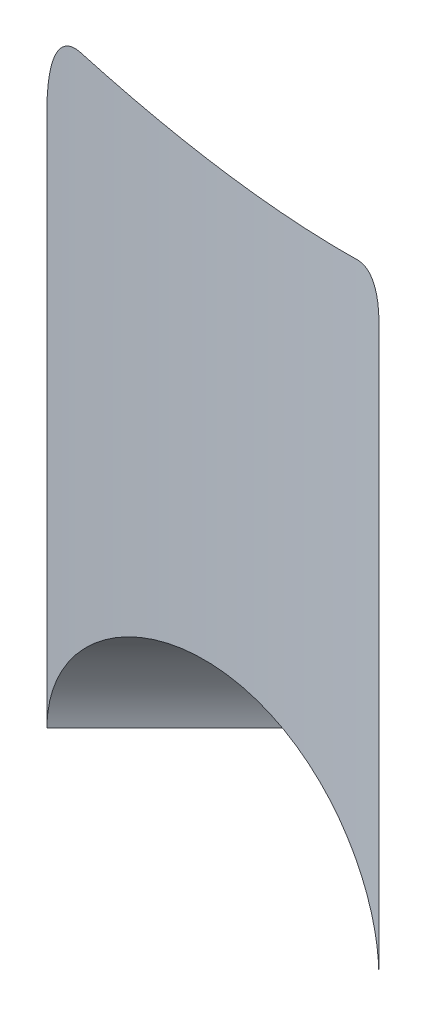
ISO-10303-21;
HEADER;
FILE_DESCRIPTION(('STEP AP214'),'2;1');
FILE_NAME('part.step','',(''),(''),'','','');
FILE_SCHEMA(('AUTOMOTIVE_DESIGN { 1 0 10303 214 1 1 1 1 }'));
ENDSEC;
DATA;
#1=APPLICATION_CONTEXT('core data for automotive mechanical design processes');
#2=APPLICATION_PROTOCOL_DEFINITION('international standard','automotive_design',2000,#1);
#3=PRODUCT_CONTEXT('',#1,'mechanical');
#4=PRODUCT('Part','Part','',(#3));
#5=PRODUCT_RELATED_PRODUCT_CATEGORY('part','',(#4));
#6=PRODUCT_DEFINITION_FORMATION('','',#4);
#7=PRODUCT_DEFINITION_CONTEXT('part definition',#1,'design');
#8=PRODUCT_DEFINITION('design','',#6,#7);
#9=PRODUCT_DEFINITION_SHAPE('','',#8);
#10=(LENGTH_UNIT() NAMED_UNIT(*) SI_UNIT(.MILLI.,.METRE.));
#11=(NAMED_UNIT(*) PLANE_ANGLE_UNIT() SI_UNIT($,.RADIAN.));
#12=(NAMED_UNIT(*) SI_UNIT($,.STERADIAN.) SOLID_ANGLE_UNIT());
#13=UNCERTAINTY_MEASURE_WITH_UNIT(LENGTH_MEASURE(1.E-05),#10,'distance_accuracy_value','');
#14=(GEOMETRIC_REPRESENTATION_CONTEXT(3) GLOBAL_UNCERTAINTY_ASSIGNED_CONTEXT((#13)) GLOBAL_UNIT_ASSIGNED_CONTEXT((#10,
#11,#12)) REPRESENTATION_CONTEXT('',''));
#15=CARTESIAN_POINT('',(0.,0.,0.));
#16=DIRECTION('',(0.,0.,1.));
#17=DIRECTION('',(1.,0.,0.));
#18=AXIS2_PLACEMENT_3D('',#15,#16,#17);
#19=CARTESIAN_POINT('',(8.98025612106916,25.4,8.98025612106915));
#20=DIRECTION('',(-0.707106781186547,0.,0.707106781186548));
#21=DIRECTION('',(0.707106781186548,0.,0.707106781186547));
#22=AXIS2_PLACEMENT_3D('',#19,#20,#21);
#23=PLANE('',#22);
#24=DIRECTION('',(0.,-1.,0.));
#25=VECTOR('',#24,1.);
#26=CARTESIAN_POINT('',(0.,25.4,0.));
#27=LINE('',#26,#25);
#28=CARTESIAN_POINT('',(0.,1.06417616721805,0.));
#29=VERTEX_POINT('',#28);
#30=CARTESIAN_POINT('',(0.,0.,0.));
#31=VERTEX_POINT('',#30);
#32=EDGE_CURVE('E86',#29,#31,#27,.T.);
#33=ORIENTED_EDGE('',*,*,#32,.F.);
#34=CARTESIAN_POINT('',(1.79605122421383,1.06417616721805,1.79605122421383));
#35=DIRECTION('',(-0.707106781186547,0.,0.707106781186548));
#36=DIRECTION('',(0.,1.,0.));
#37=AXIS2_PLACEMENT_3D('',#34,#35,#36);
#38=ELLIPSE('',#37,6.07254102360089,2.54);
#39=CARTESIAN_POINT('',(0.0480911682092522,2.46000430830473,0.0480911682092539));
#40=VERTEX_POINT('',#39);
#41=EDGE_CURVE('E11',#29,#40,#38,.F.);
#42=ORIENTED_EDGE('',*,*,#41,.T.);
#43=DIRECTION('',(-0.3638034375545,-0.857492925712545,-0.363803437554499));
#44=VECTOR('',#43,1.);
#45=CARTESIAN_POINT('',(9.56882300013742,24.9005844423548,9.56882300013741));
#46=LINE('',#45,#44);
#47=CARTESIAN_POINT('',(8.98025612106916,23.5133190044516,8.98025612106915));
#48=VERTEX_POINT('',#47);
#49=EDGE_CURVE('E43',#40,#48,#46,.F.);
#50=ORIENTED_EDGE('',*,*,#49,.T.);
#51=DIRECTION('',(0.,-1.,0.));
#52=VECTOR('',#51,1.);
#53=CARTESIAN_POINT('',(8.98025612106916,25.4,8.98025612106915));
#54=LINE('',#53,#52);
#55=CARTESIAN_POINT('',(8.98025612106918,0.,8.98025612106913));
#56=VERTEX_POINT('',#55);
#57=EDGE_CURVE('E80',#48,#56,#54,.T.);
#58=ORIENTED_EDGE('',*,*,#57,.T.);
#59=CARTESIAN_POINT('',(4.49012806053458,0.,4.49012806053458));
#60=DIRECTION('',(0.707106781186547,0.,-0.707106781186548));
#61=DIRECTION('',(-0.707106781186548,0.,-0.707106781186547));
#62=AXIS2_PLACEMENT_3D('',#59,#60,#61);
#63=CIRCLE('',#62,6.35);
#64=EDGE_CURVE('E83',#31,#56,#63,.T.);
#65=ORIENTED_EDGE('',*,*,#64,.F.);
#66=EDGE_LOOP('',(#33,#42,#50,#58,#65));
#67=FACE_BOUND('',#66,.T.);
#68=ADVANCED_FACE('F33',(#67),#23,.F.);
#69=CARTESIAN_POINT('',(0.,25.4,0.));
#70=DIRECTION('',(0.707106781186548,0.,0.707106781186547));
#71=DIRECTION('',(0.707106781186547,0.,-0.707106781186548));
#72=AXIS2_PLACEMENT_3D('',#69,#70,#71);
#73=PLANE('',#72);
#74=DIRECTION('',(0.,1.,0.));
#75=VECTOR('',#74,1.);
#76=CARTESIAN_POINT('',(-6.8922644178178,0.,6.89226441781783));
#77=LINE('',#76,#75);
#78=CARTESIAN_POINT('',(-6.89226441781783,0.,6.89226441781783));
#79=VERTEX_POINT('',#78);
#80=CARTESIAN_POINT('',(-6.8922644178178,22.2308428338847,6.89226441781783));
#81=VERTEX_POINT('',#80);
#82=EDGE_CURVE('E93',#79,#81,#77,.T.);
#83=ORIENTED_EDGE('',*,*,#82,.T.);
#84=DIRECTION('',(-0.295766009193431,0.908319842132485,0.295766009193431));
#85=VECTOR('',#84,1.);
#86=CARTESIAN_POINT('',(-6.53782235262836,21.1423243743904,6.53782235262836));
#87=LINE('',#86,#85);
#88=EDGE_CURVE('E56',#81,#29,#87,.F.);
#89=ORIENTED_EDGE('',*,*,#88,.T.);
#90=ORIENTED_EDGE('',*,*,#32,.T.);
#91=DIRECTION('',(-0.707106781186547,0.,0.707106781186548));
#92=VECTOR('',#91,1.);
#93=CARTESIAN_POINT('',(0.,0.,0.));
#94=LINE('',#93,#92);
#95=EDGE_CURVE('E87',#31,#79,#94,.T.);
#96=ORIENTED_EDGE('',*,*,#95,.T.);
#97=EDGE_LOOP('',(#83,#89,#90,#96));
#98=FACE_BOUND('',#97,.T.);
#99=ADVANCED_FACE('F140',(#98),#73,.F.);
#100=CARTESIAN_POINT('',(-4.49112806053456,0.,13.4713841816037));
#101=DIRECTION('',(0.707106781186547,0.,-0.707106781186548));
#102=DIRECTION('',(-0.707106781186548,0.,-0.707106781186547));
#103=AXIS2_PLACEMENT_3D('',#100,#101,#102);
#104=CYLINDRICAL_SURFACE('',#103,6.35);
#105=ORIENTED_EDGE('',*,*,#64,.T.);
#106=CARTESIAN_POINT('',(8.98025612106918,0.,8.98025612106913));
#107=CARTESIAN_POINT('',(8.98028727916899,0.158357361612671,8.98026703404575));
#108=CARTESIAN_POINT('',(8.97344885303893,0.316703547991888,8.97868788621782));
#109=CARTESIAN_POINT('',(8.94626316417468,0.632120023921862,8.97242969485254));
#110=CARTESIAN_POINT('',(8.92592031799142,0.789190713622889,8.96775166478971));
#111=CARTESIAN_POINT('',(8.87207146439379,1.10023989040585,8.95540235355817));
#112=CARTESIAN_POINT('',(8.83862223513458,1.25422874362985,8.94774398447619));
#113=CARTESIAN_POINT('',(8.75898183101324,1.55870422554307,8.92958157323562));
#114=CARTESIAN_POINT('',(8.71279013319498,1.70919071021873,8.91907741428495));
#115=CARTESIAN_POINT('',(8.60827087490437,2.00547837122198,8.89542745209661));
#116=CARTESIAN_POINT('',(8.54995676664387,2.15128453597488,8.88228457758399));
#117=CARTESIAN_POINT('',(8.42179571849198,2.43754587588542,8.85357256706417));
#118=CARTESIAN_POINT('',(8.3519444226039,2.57799900519756,8.83800251477358));
#119=CARTESIAN_POINT('',(8.20143908175379,2.85277046314988,8.80468860836407));
#120=CARTESIAN_POINT('',(8.12078169764317,2.98708687823385,8.78694408246445));
#121=CARTESIAN_POINT('',(7.9494438853484,3.24894658891941,8.74954892860098));
#122=CARTESIAN_POINT('',(7.8587596094564,3.37648725641468,8.72989756926768));
#123=CARTESIAN_POINT('',(7.66343482997481,3.63043560850455,8.68794536099224));
#124=CARTESIAN_POINT('',(7.55832299261667,3.7564671292079,8.66556113335063));
#125=CARTESIAN_POINT('',(7.33892041120087,4.00000790528168,8.61931767417679));
#126=CARTESIAN_POINT('',(7.22462640112382,4.11751409973217,8.59545791851298));
#127=CARTESIAN_POINT('',(6.86941460791614,4.45667316020166,8.52213913900117));
#128=CARTESIAN_POINT('',(6.61605894740883,4.6651052953412,8.47091714711418));
#129=CARTESIAN_POINT('',(6.04590232373012,5.07189214406527,8.35869242579117));
#130=CARTESIAN_POINT('',(5.72519880037003,5.26462935043573,8.29733255154434));
#131=CARTESIAN_POINT('',(5.0595157430664,5.6019940496537,8.17432400818323));
#132=CARTESIAN_POINT('',(4.71452278011242,5.74659467191534,8.11267519718465));
#133=CARTESIAN_POINT('',(3.94669164800132,6.00982071646219,7.98069778263842));
#134=CARTESIAN_POINT('',(3.52074873579007,6.11955699768101,7.91072395658688));
#135=CARTESIAN_POINT('',(2.65682435432407,6.27684363167682,7.77586773949873));
#136=CARTESIAN_POINT('',(2.21883656487727,6.32436067561438,7.71098809306805));
#137=CARTESIAN_POINT('',(1.26569672374652,6.36277423726781,7.57760085290529));
#138=CARTESIAN_POINT('',(0.749931810231433,6.34282883649299,7.51031206179378));
#139=CARTESIAN_POINT('',(-0.274613403661845,6.22456939109219,7.38625198507984));
#140=CARTESIAN_POINT('',(-0.78338374074013,6.12615339126273,7.32949450092641));
#141=CARTESIAN_POINT('',(-1.55500021020534,5.91422275931301,7.25030495161505));
#142=CARTESIAN_POINT('',(-1.82509108260923,5.82762450377184,7.22395113302292));
#143=CARTESIAN_POINT('',(-2.35714278570393,5.63114788578902,7.17456676234475));
#144=CARTESIAN_POINT('',(-2.61910176620909,5.52126426927965,7.15153696225926));
#145=CARTESIAN_POINT('',(-3.13186338808041,5.27817730602937,7.10879640283464));
#146=CARTESIAN_POINT('',(-3.38268043080931,5.1450052294321,7.08908126155768));
#147=CARTESIAN_POINT('',(-3.87031808586246,4.85499463840235,7.0528440054397));
#148=CARTESIAN_POINT('',(-4.10714638953237,4.69816930087821,7.0363201244066));
#149=CARTESIAN_POINT('',(-4.63397929921437,4.30802081557143,7.00166087900707));
#150=CARTESIAN_POINT('',(-4.91776478791308,4.06604202732665,6.9846087884714));
#151=CARTESIAN_POINT('',(-5.44411211289728,3.5406921348388,6.95531909975687));
#152=CARTESIAN_POINT('',(-5.68673589145521,3.25738444124862,6.94307423026535));
#153=CARTESIAN_POINT('',(-6.07528920823813,2.70997798986592,6.92480447895513));
#154=CARTESIAN_POINT('',(-6.23084641787115,2.45282885630105,6.91803354775418));
#155=CARTESIAN_POINT('',(-6.43085002420232,2.05091602127369,6.90973725331319));
#156=CARTESIAN_POINT('',(-6.49193956444534,1.91432160412493,6.90728262725948));
#157=CARTESIAN_POINT('',(-6.60206280464132,1.63637694326537,6.9029552598737));
#158=CARTESIAN_POINT('',(-6.65110314992255,1.49502937012388,6.90108219764866));
#159=CARTESIAN_POINT('',(-6.72611021498072,1.242463096127,6.89826634679126));
#160=CARTESIAN_POINT('',(-6.75479083363269,1.13204389202404,6.8972082905587));
#161=CARTESIAN_POINT('',(-6.80425084045112,0.909460409656872,6.89540228012866));
#162=CARTESIAN_POINT('',(-6.82503190382061,0.797296506636138,6.89465426018094));
#163=CARTESIAN_POINT('',(-6.85848975961948,0.571285726372531,6.8934572220502));
#164=CARTESIAN_POINT('',(-6.87113249066589,0.457433790108938,6.89300946021647));
#165=CARTESIAN_POINT('',(-6.88803183451293,0.229057485391639,6.89241330191789));
#166=CARTESIAN_POINT('',(-6.89228462083614,0.114532833997759,6.89226504204884));
#167=CARTESIAN_POINT('',(-6.89226441781782,0.,6.89226441781783));
#168=B_SPLINE_CURVE_WITH_KNOTS('',3,(#106,#107,#108,#109,#110,#111,#112,#113,#114,#115,#116,
#117,#118,#119,#120,#121,#122,#123,#124,#125,#126,#127,#128,#129,#130,#131,#132,#133,#134,#135,
#136,#137,#138,#139,#140,#141,#142,#143,#144,#145,#146,#147,#148,#149,#150,#151,#152,#153,#154,
#155,#156,#157,#158,#159,#160,#161,#162,#163,#164,#165,#166,#167),.UNSPECIFIED.,.F.,.F.,(4,2,2,
2,2,2,2,2,2,2,2,2,2,2,2,2,2,2,2,2,2,2,2,2,2,2,2,2,2,2,4),(0.,0.474899283316578,
0.949643329737384,1.42235308048794,1.89508223432699,2.36728957551573,2.8396756132382,
3.31220795931864,3.78492226789071,4.28129485311872,4.77784478218178,5.77041751284109,
6.9037016741812,8.03761739559084,9.36870851248791,10.700511933162,12.2558482059879,
13.8132085940499,14.6668664077079,15.520717044695,16.3734298715187,17.2256694063787,
18.3415980610763,19.4558322190085,20.3537381112302,20.8022280447606,21.2504700707144,
21.5924703770941,21.9343981173653,22.277747780785,22.6212540026002),.UNSPECIFIED.);
#169=EDGE_CURVE('E90',#56,#79,#168,.T.);
#170=ORIENTED_EDGE('',*,*,#169,.T.);
#171=ORIENTED_EDGE('',*,*,#95,.F.);
#172=EDGE_LOOP('',(#105,#170,#171));
#173=FACE_BOUND('',#172,.T.);
#174=ADVANCED_FACE('F99',(#173),#104,.F.);
#175=CARTESIAN_POINT('',(-9.83817531139002,0.,90.6604804010124));
#176=DIRECTION('',(0.,1.,0.));
#177=DIRECTION('',(0.,0.,1.));
#178=AXIS2_PLACEMENT_3D('',#175,#176,#177);
#179=CYLINDRICAL_SURFACE('',#178,83.82);
#180=CARTESIAN_POINT('',(-9.83817531139002,253.802829579969,90.6604804010124));
#181=DIRECTION('',(-0.122505742761241,-0.343127762229374,0.931265634380427));
#182=DIRECTION('',(-0.0447520762715554,0.93928874090317,0.340196873709801));
#183=AXIS2_PLACEMENT_3D('',#180,#181,#182);
#184=ELLIPSE('',#183,244.282186481804,83.82);
#185=CARTESIAN_POINT('',(-5.41919327466183,25.0498937114769,6.95704559837675));
#186=VERTEX_POINT('',#185);
#187=CARTESIAN_POINT('',(7.80224593103035,25.1081782440381,8.71776908151817));
#188=VERTEX_POINT('',#187);
#189=EDGE_CURVE('E102',#186,#188,#184,.T.);
#190=ORIENTED_EDGE('',*,*,#189,.F.);
#191=CARTESIAN_POINT('',(-5.41919327466181,25.0498937114769,6.95704559837675));
#192=CARTESIAN_POINT('',(-5.46792927331675,25.0603797133781,6.95447111562173));
#193=CARTESIAN_POINT('',(-5.51754291588686,25.0676681331261,6.95189603331436));
#194=CARTESIAN_POINT('',(-5.6174977236999,25.0746691932178,6.94679736314859));
#195=CARTESIAN_POINT('',(-5.66784113475924,25.0743482210786,6.94427405305914));
#196=CARTESIAN_POINT('',(-5.76814208525486,25.0648009261332,6.93933743479997));
#197=CARTESIAN_POINT('',(-5.81809407177586,25.0555091894101,6.93692507107862));
#198=CARTESIAN_POINT('',(-5.91520991008499,25.0277106989421,6.93231848030639));
#199=CARTESIAN_POINT('',(-5.96238202921349,25.0092329910922,6.93012359167261));
#200=CARTESIAN_POINT('',(-6.04852165565592,24.9660455093643,6.92618261902215));
#201=CARTESIAN_POINT('',(-6.08784569391755,24.9420381467117,6.92441396863963));
#202=CARTESIAN_POINT('',(-6.16250084689316,24.8884053553099,6.92110366817152));
#203=CARTESIAN_POINT('',(-6.19782528509229,24.8587707474635,6.91956239638591));
#204=CARTESIAN_POINT('',(-6.28364036564621,24.7768041053787,6.9158658459698));
#205=CARTESIAN_POINT('',(-6.33106144675267,24.7212688776583,6.91387214574572));
#206=CARTESIAN_POINT('',(-6.4168909911108,24.6036497762031,6.91032182600924));
#207=CARTESIAN_POINT('',(-6.45527535763288,24.5415490193944,6.9087663729763));
#208=CARTESIAN_POINT('',(-6.52255693166122,24.417275516785,6.90607675665221));
#209=CARTESIAN_POINT('',(-6.55188596098306,24.3553318523103,6.90492287829746));
#210=CARTESIAN_POINT('',(-6.60523235745516,24.2291644402506,6.90284677095969));
#211=CARTESIAN_POINT('',(-6.62924455395334,24.164938542992,6.90192476735899));
#212=CARTESIAN_POINT('',(-6.67300311853558,24.0346664619234,6.90025973906762));
#213=CARTESIAN_POINT('',(-6.69272467549963,23.9686120575894,6.89951775264685));
#214=CARTESIAN_POINT('',(-6.72847390166795,23.8355011382645,6.89818295427989));
#215=CARTESIAN_POINT('',(-6.74450028540478,23.7684442831559,6.89759019423961));
#216=CARTESIAN_POINT('',(-6.78522384711489,23.5787989891363,6.89609301991327));
#217=CARTESIAN_POINT('',(-6.80635812095304,23.4554453349982,6.89532775124718));
#218=CARTESIAN_POINT('',(-6.84082338501324,23.2075771818998,6.894087604184));
#219=CARTESIAN_POINT('',(-6.85414576777753,23.0830615554637,6.89361304607793));
#220=CARTESIAN_POINT('',(-6.87424840691289,22.8371850677382,6.8928993166259));
#221=CARTESIAN_POINT('',(-6.88120841048237,22.7158383088332,6.89265367386462));
#222=CARTESIAN_POINT('',(-6.89018560649972,22.4732612871936,6.89233759438269));
#223=CARTESIAN_POINT('',(-6.89221519597924,22.352031500012,6.89226671822219));
#224=CARTESIAN_POINT('',(-6.89226441781783,22.2308428338847,6.89226441781783));
#225=B_SPLINE_CURVE_WITH_KNOTS('',3,(#191,#192,#193,#194,#195,#196,#197,#198,#199,#200,#201,
#202,#203,#204,#205,#206,#207,#208,#209,#210,#211,#212,#213,#214,#215,#216,#217,#218,#219,#220,
#221,#222,#223,#224),.UNSPECIFIED.,.F.,.F.,(4,2,2,2,2,2,2,2,2,2,2,2,2,2,2,2,4),(0.,
0.149932409726086,0.300527229254799,0.452228530362262,0.603453176463626,0.741196671673852,
0.879166813200607,1.09706770872666,1.31554322540648,1.52087543399407,1.72640646080859,
1.93309614028769,2.13985761432299,2.51494563014032,2.89044616026799,3.25497710395165,
3.61859051807468),.UNSPECIFIED.);
#226=EDGE_CURVE('E127',#186,#81,#225,.T.);
#227=ORIENTED_EDGE('',*,*,#226,.T.);
#228=ORIENTED_EDGE('',*,*,#82,.F.);
#229=ORIENTED_EDGE('',*,*,#169,.F.);
#230=ORIENTED_EDGE('',*,*,#57,.F.);
#231=CARTESIAN_POINT('',(8.98025612106916,23.5133190044516,8.98025612106915));
#232=CARTESIAN_POINT('',(8.98023460045048,23.5756911872183,8.9802513357017));
#233=CARTESIAN_POINT('',(8.97913636982893,23.6380854908507,8.9799981590966));
#234=CARTESIAN_POINT('',(8.97429066328295,23.7629090551734,8.97888187261673));
#235=CARTESIAN_POINT('',(8.97053695949754,23.8253380526386,8.97801732890919));
#236=CARTESIAN_POINT('',(8.95978354212497,23.9510537538258,8.97554193009764));
#237=CARTESIAN_POINT('',(8.95272632978088,24.0143355406053,8.97391785557008));
#238=CARTESIAN_POINT('',(8.93461542283274,24.1402485200707,8.96975378078141));
#239=CARTESIAN_POINT('',(8.92356567391383,24.2028802924962,8.96721468481068));
#240=CARTESIAN_POINT('',(8.8949811589843,24.3339549494447,8.96065486717985));
#241=CARTESIAN_POINT('',(8.87686126423905,24.4022682885822,8.95650064239004));
#242=CARTESIAN_POINT('',(8.83268234606462,24.535995025289,8.94639349533072));
#243=CARTESIAN_POINT('',(8.80665446315817,24.6014186649586,8.94044762903142));
#244=CARTESIAN_POINT('',(8.75259916285128,24.7102638828907,8.92813645547346));
#245=CARTESIAN_POINT('',(8.72694894651636,24.7549059057805,8.92230426084464));
#246=CARTESIAN_POINT('',(8.66916467236864,24.8396029106341,8.90920123879461));
#247=CARTESIAN_POINT('',(8.63703915546813,24.8796638271003,8.90193230667047));
#248=CARTESIAN_POINT('',(8.57276044705954,24.9458568527078,8.88743652143495));
#249=CARTESIAN_POINT('',(8.54179227147155,24.9731870202227,8.88046853432232));
#250=CARTESIAN_POINT('',(8.47580617660353,25.0220244915119,8.86566626557758));
#251=CARTESIAN_POINT('',(8.44079669802146,25.0435436290324,8.85783379097039));
#252=CARTESIAN_POINT('',(8.36768356201726,25.079970646639,8.84153089530509));
#253=CARTESIAN_POINT('',(8.32958305344581,25.0948851572747,8.8330611240875));
#254=CARTESIAN_POINT('',(8.25131784157799,25.1181304808646,8.81572332372597));
#255=CARTESIAN_POINT('',(8.21114339867173,25.1264265096356,8.80685344596299));
#256=CARTESIAN_POINT('',(8.10898689692726,25.1396478644573,8.78438067985842));
#257=CARTESIAN_POINT('',(8.0465392920084,25.1405704289719,8.77071756962474));
#258=CARTESIAN_POINT('',(7.92300729608349,25.1315647421516,8.74383429588649));
#259=CARTESIAN_POINT('',(7.86191548731093,25.1217612265231,8.73061084457004));
#260=CARTESIAN_POINT('',(7.80224593103036,25.1081782440381,8.71776908151818));
#261=B_SPLINE_CURVE_WITH_KNOTS('',3,(#231,#232,#233,#234,#235,#236,#237,#238,#239,#240,#241,
#242,#243,#244,#245,#246,#247,#248,#249,#250,#251,#252,#253,#254,#255,#256,#257,#258,#259,#260),
.UNSPECIFIED.,.F.,.F.,(4,2,2,2,2,2,2,2,2,2,2,2,2,2,4),(0.,0.187140181449832,0.374720722661642,
0.565695007915064,0.756481073827163,0.968512398801828,1.17971936487347,1.33469603491155,
1.48946961308405,1.61458396088044,1.73944156726286,1.86417354022542,1.98955681553893,
2.18020990247597,2.36866918789505),.UNSPECIFIED.);
#262=EDGE_CURVE('E123',#48,#188,#261,.T.);
#263=ORIENTED_EDGE('',*,*,#262,.T.);
#264=EDGE_LOOP('',(#190,#227,#228,#229,#230,#263));
#265=FACE_BOUND('',#264,.T.);
#266=ADVANCED_FACE('F92',(#265),#179,.F.);
#267=CARTESIAN_POINT('',(0.177948680482893,0.498418532466408,-1.35273242773638));
#268=DIRECTION('',(-0.122505742761241,-0.343127762229374,0.931265634380427));
#269=DIRECTION('',(0.,-0.938333344565717,-0.345731882354109));
#270=AXIS2_PLACEMENT_3D('',#267,#268,#269);
#271=PLANE('',#270);
#272=DIRECTION('',(-0.363803437554499,-0.857492925712544,-0.363803437554499));
#273=VECTOR('',#272,1.);
#274=CARTESIAN_POINT('',(-2.21694565868924,1.49271719371156,-1.30142250820141));
#275=LINE('',#274,#273);
#276=CARTESIAN_POINT('',(0.311164586613554,7.45153018718086,1.22668773710138));
#277=VERTEX_POINT('',#276);
#278=EDGE_CURVE('E97',#188,#277,#275,.T.);
#279=ORIENTED_EDGE('',*,*,#278,.T.);
#280=DIRECTION('',(-0.295766009193431,0.908319842132485,0.295766009193431));
#281=VECTOR('',#280,1.);
#282=CARTESIAN_POINT('',(2.39310688157883,1.05772752591886,-0.8552545578639));
#283=LINE('',#282,#281);
#284=EDGE_CURVE('E128',#277,#186,#283,.T.);
#285=ORIENTED_EDGE('',*,*,#284,.T.);
#286=ORIENTED_EDGE('',*,*,#189,.T.);
#287=EDGE_LOOP('',(#279,#285,#286));
#288=FACE_BOUND('',#287,.T.);
#289=ADVANCED_FACE('F118',(#288),#271,.F.);
#290=CARTESIAN_POINT('',(-2.52811024530279,0.621172677648948,1.06399220312487));
#291=DIRECTION('',(-0.363803437554499,-0.857492925712544,-0.363803437554499));
#292=DIRECTION('',(0.920574617898324,-0.390566732942472,0.));
#293=AXIS2_PLACEMENT_3D('',#290,#291,#292);
#294=CYLINDRICAL_SURFACE('',#293,2.54);
#295=ORIENTED_EDGE('',*,*,#262,.F.);
#296=ORIENTED_EDGE('',*,*,#49,.F.);
#297=CARTESIAN_POINT('',(0.,6.57998567111825,3.59210244842766));
#298=DIRECTION('',(-0.991812087080374,0.0764297835548264,-0.102309687258999));
#299=DIRECTION('',(-0.0360711368241766,-0.936174036690414,-0.349681349395398));
#300=AXIS2_PLACEMENT_3D('',#297,#298,#299);
#301=ELLIPSE('',#300,7.63893086195947,2.54);
#302=EDGE_CURVE('E38',#277,#40,#301,.T.);
#303=ORIENTED_EDGE('',*,*,#302,.F.);
#304=ORIENTED_EDGE('',*,*,#278,.F.);
#305=EDGE_LOOP('',(#295,#296,#303,#304));
#306=FACE_BOUND('',#305,.T.);
#307=ADVANCED_FACE('F35',(#306),#294,.T.);
#308=CARTESIAN_POINT('',(2.08194229496528,0.186183009856254,1.51016015346238));
#309=DIRECTION('',(-0.295766009193431,0.908319842132485,0.295766009193431));
#310=DIRECTION('',(0.,-0.309618197676435,0.950860963373508));
#311=AXIS2_PLACEMENT_3D('',#308,#309,#310);
#312=CYLINDRICAL_SURFACE('',#311,2.54);
#313=ORIENTED_EDGE('',*,*,#41,.F.);
#314=ORIENTED_EDGE('',*,*,#88,.F.);
#315=ORIENTED_EDGE('',*,*,#226,.F.);
#316=ORIENTED_EDGE('',*,*,#284,.F.);
#317=ORIENTED_EDGE('',*,*,#302,.T.);
#318=EDGE_LOOP('',(#313,#314,#315,#316,#317));
#319=FACE_BOUND('',#318,.T.);
#320=ADVANCED_FACE('F134',(#319),#312,.T.);
#321=CLOSED_SHELL('',(#68,#99,#174,#266,#289,#307,#320));
#322=MANIFOLD_SOLID_BREP('B2',#321);
#323=ADVANCED_BREP_SHAPE_REPRESENTATION('',(#18,#322),#14);
#324=SHAPE_DEFINITION_REPRESENTATION(#9,#323);
ENDSEC;
END-ISO-10303-21;
